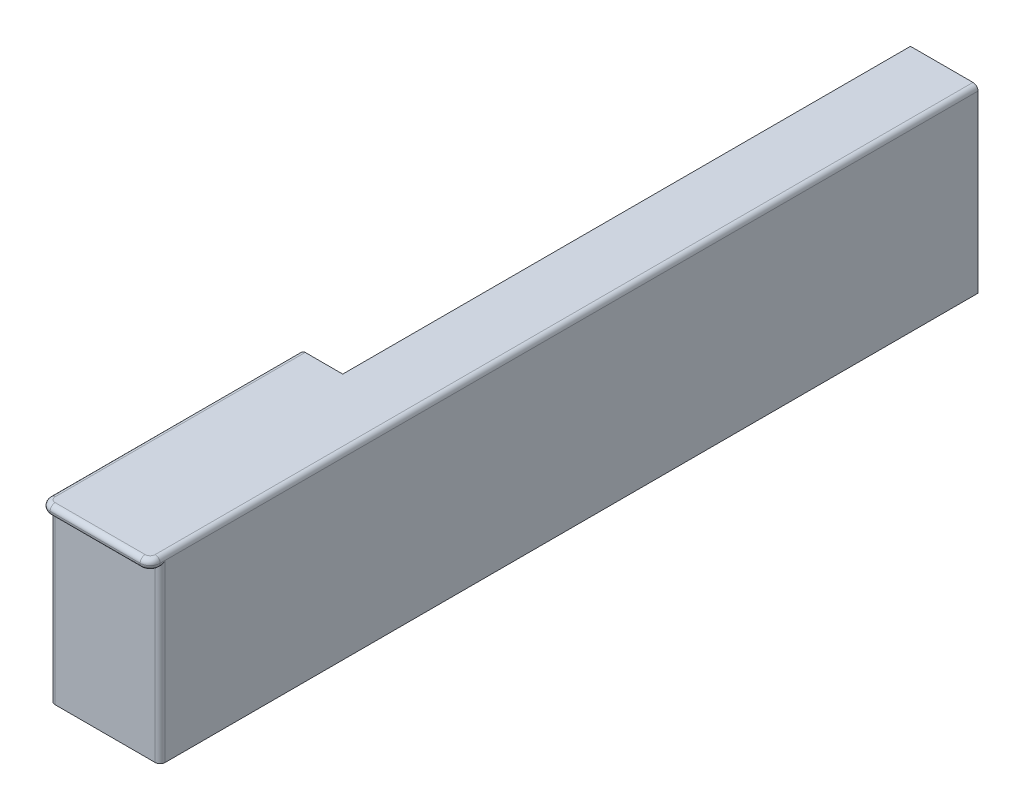
ISO-10303-21;
HEADER;
FILE_DESCRIPTION(('STEP AP214'),'2;1');
FILE_NAME('part.step','',(''),(''),'','','');
FILE_SCHEMA(('AUTOMOTIVE_DESIGN { 1 0 10303 214 1 1 1 1 }'));
ENDSEC;
DATA;
#1=APPLICATION_CONTEXT('core data for automotive mechanical design processes');
#2=APPLICATION_PROTOCOL_DEFINITION('international standard','automotive_design',2000,#1);
#3=PRODUCT_CONTEXT('',#1,'mechanical');
#4=PRODUCT('Part','Part','',(#3));
#5=PRODUCT_RELATED_PRODUCT_CATEGORY('part','',(#4));
#6=PRODUCT_DEFINITION_FORMATION('','',#4);
#7=PRODUCT_DEFINITION_CONTEXT('part definition',#1,'design');
#8=PRODUCT_DEFINITION('design','',#6,#7);
#9=PRODUCT_DEFINITION_SHAPE('','',#8);
#10=(LENGTH_UNIT() NAMED_UNIT(*) SI_UNIT(.MILLI.,.METRE.));
#11=(NAMED_UNIT(*) PLANE_ANGLE_UNIT() SI_UNIT($,.RADIAN.));
#12=(NAMED_UNIT(*) SI_UNIT($,.STERADIAN.) SOLID_ANGLE_UNIT());
#13=UNCERTAINTY_MEASURE_WITH_UNIT(LENGTH_MEASURE(1.E-05),#10,'distance_accuracy_value','');
#14=(GEOMETRIC_REPRESENTATION_CONTEXT(3) GLOBAL_UNCERTAINTY_ASSIGNED_CONTEXT((#13)) GLOBAL_UNIT_ASSIGNED_CONTEXT((#10,
#11,#12)) REPRESENTATION_CONTEXT('',''));
#15=CARTESIAN_POINT('',(0.,0.,0.));
#16=DIRECTION('',(0.,0.,1.));
#17=DIRECTION('',(1.,0.,0.));
#18=AXIS2_PLACEMENT_3D('',#15,#16,#17);
#19=CARTESIAN_POINT('',(-11.,36.,81.75));
#20=DIRECTION('',(0.,0.,-1.));
#21=DIRECTION('',(-1.,0.,0.));
#22=AXIS2_PLACEMENT_3D('',#19,#20,#21);
#23=PLANE('',#22);
#24=DIRECTION('',(1.,0.,0.));
#25=VECTOR('',#24,1.);
#26=CARTESIAN_POINT('',(-11.,34.,81.75));
#27=LINE('',#26,#25);
#28=CARTESIAN_POINT('',(-10.,34.,81.75));
#29=VERTEX_POINT('',#28);
#30=CARTESIAN_POINT('',(10.,34.,81.75));
#31=VERTEX_POINT('',#30);
#32=EDGE_CURVE('E211',#29,#31,#27,.T.);
#33=ORIENTED_EDGE('',*,*,#32,.F.);
#34=DIRECTION('',(0.,-1.,0.));
#35=VECTOR('',#34,1.);
#36=CARTESIAN_POINT('',(-10.,0.,81.75));
#37=LINE('',#36,#35);
#38=CARTESIAN_POINT('',(-10.,0.,81.75));
#39=VERTEX_POINT('',#38);
#40=EDGE_CURVE('E156',#29,#39,#37,.T.);
#41=ORIENTED_EDGE('',*,*,#40,.T.);
#42=DIRECTION('',(1.,0.,0.));
#43=VECTOR('',#42,1.);
#44=CARTESIAN_POINT('',(-11.,0.,81.75));
#45=LINE('',#44,#43);
#46=CARTESIAN_POINT('',(10.,0.,81.75));
#47=VERTEX_POINT('',#46);
#48=EDGE_CURVE('E213',#39,#47,#45,.T.);
#49=ORIENTED_EDGE('',*,*,#48,.T.);
#50=DIRECTION('',(0.,-1.,0.));
#51=VECTOR('',#50,1.);
#52=CARTESIAN_POINT('',(10.,36.,81.75));
#53=LINE('',#52,#51);
#54=EDGE_CURVE('E233',#47,#31,#53,.F.);
#55=ORIENTED_EDGE('',*,*,#54,.T.);
#56=EDGE_LOOP('',(#33,#41,#49,#55));
#57=FACE_BOUND('',#56,.T.);
#58=ADVANCED_FACE('F43',(#57),#23,.F.);
#59=CARTESIAN_POINT('',(-10.,36.,80.75));
#60=DIRECTION('',(0.,1.,0.));
#61=DIRECTION('',(0.,0.,1.));
#62=AXIS2_PLACEMENT_3D('',#59,#60,#61);
#63=CYLINDRICAL_SURFACE('',#62,1.);
#64=ORIENTED_EDGE('',*,*,#40,.F.);
#65=CARTESIAN_POINT('',(-10.,35.,80.75));
#66=DIRECTION('',(0.,-0.707106781186547,-0.707106781186547));
#67=DIRECTION('',(0.,0.707106781186547,-0.707106781186547));
#68=AXIS2_PLACEMENT_3D('',#65,#66,#67);
#69=ELLIPSE('',#68,1.41421356237309,1.);
#70=CARTESIAN_POINT('',(-11.,35.,80.75));
#71=VERTEX_POINT('',#70);
#72=EDGE_CURVE('E154',#29,#71,#69,.T.);
#73=ORIENTED_EDGE('',*,*,#72,.T.);
#74=DIRECTION('',(0.,-1.,0.));
#75=VECTOR('',#74,1.);
#76=CARTESIAN_POINT('',(-11.,36.,80.75));
#77=LINE('',#76,#75);
#78=CARTESIAN_POINT('',(-11.,0.,80.75));
#79=VERTEX_POINT('',#78);
#80=EDGE_CURVE('E141',#79,#71,#77,.F.);
#81=ORIENTED_EDGE('',*,*,#80,.F.);
#82=CARTESIAN_POINT('',(-10.,0.,80.75));
#83=DIRECTION('',(0.,1.,0.));
#84=DIRECTION('',(0.,0.,1.));
#85=AXIS2_PLACEMENT_3D('',#82,#83,#84);
#86=CIRCLE('',#85,1.);
#87=EDGE_CURVE('E151',#39,#79,#86,.F.);
#88=ORIENTED_EDGE('',*,*,#87,.F.);
#89=EDGE_LOOP('',(#64,#73,#81,#88));
#90=FACE_BOUND('',#89,.T.);
#91=ADVANCED_FACE('F155',(#90),#63,.T.);
#92=CARTESIAN_POINT('',(10.,36.,80.75));
#93=DIRECTION('',(0.,-1.,0.));
#94=DIRECTION('',(0.,0.,-1.));
#95=AXIS2_PLACEMENT_3D('',#92,#93,#94);
#96=CYLINDRICAL_SURFACE('',#95,1.);
#97=DIRECTION('',(0.,-1.,0.));
#98=VECTOR('',#97,1.);
#99=CARTESIAN_POINT('',(11.,36.,80.75));
#100=LINE('',#99,#98);
#101=CARTESIAN_POINT('',(11.,35.,80.75));
#102=VERTEX_POINT('',#101);
#103=CARTESIAN_POINT('',(11.,0.,80.75));
#104=VERTEX_POINT('',#103);
#105=EDGE_CURVE('E150',#102,#104,#100,.T.);
#106=ORIENTED_EDGE('',*,*,#105,.F.);
#107=CARTESIAN_POINT('',(10.,35.,80.75));
#108=DIRECTION('',(0.,-0.707106781186547,-0.707106781186547));
#109=DIRECTION('',(0.,0.707106781186547,-0.707106781186547));
#110=AXIS2_PLACEMENT_3D('',#107,#108,#109);
#111=ELLIPSE('',#110,1.41421356237309,1.);
#112=EDGE_CURVE('E51',#102,#31,#111,.T.);
#113=ORIENTED_EDGE('',*,*,#112,.T.);
#114=ORIENTED_EDGE('',*,*,#54,.F.);
#115=CARTESIAN_POINT('',(10.,0.,80.75));
#116=DIRECTION('',(0.,1.,0.));
#117=DIRECTION('',(0.,0.,1.));
#118=AXIS2_PLACEMENT_3D('',#115,#116,#117);
#119=CIRCLE('',#118,1.);
#120=EDGE_CURVE('E236',#104,#47,#119,.F.);
#121=ORIENTED_EDGE('',*,*,#120,.F.);
#122=EDGE_LOOP('',(#106,#113,#114,#121));
#123=FACE_BOUND('',#122,.T.);
#124=ADVANCED_FACE('F326',(#123),#96,.T.);
#125=CARTESIAN_POINT('',(11.,36.,81.75));
#126=DIRECTION('',(-1.,0.,0.));
#127=DIRECTION('',(0.,0.,1.));
#128=AXIS2_PLACEMENT_3D('',#125,#126,#127);
#129=PLANE('',#128);
#130=DIRECTION('',(0.,-1.,0.));
#131=VECTOR('',#130,1.);
#132=CARTESIAN_POINT('',(11.,36.,-81.75));
#133=LINE('',#132,#131);
#134=CARTESIAN_POINT('',(11.,35.,-81.75));
#135=VERTEX_POINT('',#134);
#136=CARTESIAN_POINT('',(11.,0.,-81.75));
#137=VERTEX_POINT('',#136);
#138=EDGE_CURVE('E224',#135,#137,#133,.T.);
#139=ORIENTED_EDGE('',*,*,#138,.F.);
#140=DIRECTION('',(0.,0.,-1.));
#141=VECTOR('',#140,1.);
#142=CARTESIAN_POINT('',(11.,35.,81.75));
#143=LINE('',#142,#141);
#144=EDGE_CURVE('E167',#135,#102,#143,.F.);
#145=ORIENTED_EDGE('',*,*,#144,.T.);
#146=ORIENTED_EDGE('',*,*,#105,.T.);
#147=DIRECTION('',(0.,0.,-1.));
#148=VECTOR('',#147,1.);
#149=CARTESIAN_POINT('',(11.,0.,81.75));
#150=LINE('',#149,#148);
#151=EDGE_CURVE('E218',#104,#137,#150,.T.);
#152=ORIENTED_EDGE('',*,*,#151,.T.);
#153=EDGE_LOOP('',(#139,#145,#146,#152));
#154=FACE_BOUND('',#153,.T.);
#155=ADVANCED_FACE('F261',(#154),#129,.F.);
#156=CARTESIAN_POINT('',(-11.,36.,-81.75));
#157=DIRECTION('',(0.,0.,-1.));
#158=DIRECTION('',(-1.,0.,0.));
#159=AXIS2_PLACEMENT_3D('',#156,#157,#158);
#160=PLANE('',#159);
#161=DIRECTION('',(0.,1.,0.));
#162=VECTOR('',#161,1.);
#163=CARTESIAN_POINT('',(-2.5,0.,-81.75));
#164=LINE('',#163,#162);
#165=CARTESIAN_POINT('',(-2.5,0.,-81.75));
#166=VERTEX_POINT('',#165);
#167=CARTESIAN_POINT('',(-2.5,36.,-81.75));
#168=VERTEX_POINT('',#167);
#169=EDGE_CURVE('E183',#166,#168,#164,.T.);
#170=ORIENTED_EDGE('',*,*,#169,.T.);
#171=DIRECTION('',(1.,0.,0.));
#172=VECTOR('',#171,1.);
#173=CARTESIAN_POINT('',(-11.,36.,-81.75));
#174=LINE('',#173,#172);
#175=CARTESIAN_POINT('',(10.,36.,-81.75));
#176=VERTEX_POINT('',#175);
#177=EDGE_CURVE('E223',#168,#176,#174,.T.);
#178=ORIENTED_EDGE('',*,*,#177,.T.);
#179=CARTESIAN_POINT('',(10.,35.,-81.75));
#180=DIRECTION('',(0.,0.,-1.));
#181=DIRECTION('',(-1.,0.,0.));
#182=AXIS2_PLACEMENT_3D('',#179,#180,#181);
#183=CIRCLE('',#182,1.);
#184=EDGE_CURVE('E172',#176,#135,#183,.T.);
#185=ORIENTED_EDGE('',*,*,#184,.T.);
#186=ORIENTED_EDGE('',*,*,#138,.T.);
#187=DIRECTION('',(1.,0.,0.));
#188=VECTOR('',#187,1.);
#189=CARTESIAN_POINT('',(-11.,0.,-81.75));
#190=LINE('',#189,#188);
#191=EDGE_CURVE('E228',#166,#137,#190,.T.);
#192=ORIENTED_EDGE('',*,*,#191,.F.);
#193=EDGE_LOOP('',(#170,#178,#185,#186,#192));
#194=FACE_BOUND('',#193,.T.);
#195=ADVANCED_FACE('F254',(#194),#160,.T.);
#196=CARTESIAN_POINT('',(-11.,36.,81.75));
#197=DIRECTION('',(-1.,0.,0.));
#198=DIRECTION('',(0.,0.,1.));
#199=AXIS2_PLACEMENT_3D('',#196,#197,#198);
#200=PLANE('',#199);
#201=DIRECTION('',(0.,1.,0.));
#202=VECTOR('',#201,1.);
#203=CARTESIAN_POINT('',(-11.,0.,31.75));
#204=LINE('',#203,#202);
#205=CARTESIAN_POINT('',(-11.,0.,31.75));
#206=VERTEX_POINT('',#205);
#207=CARTESIAN_POINT('',(-11.,35.,31.75));
#208=VERTEX_POINT('',#207);
#209=EDGE_CURVE('E57',#206,#208,#204,.T.);
#210=ORIENTED_EDGE('',*,*,#209,.F.);
#211=DIRECTION('',(0.,0.,-1.));
#212=VECTOR('',#211,1.);
#213=CARTESIAN_POINT('',(-11.,0.,81.75));
#214=LINE('',#213,#212);
#215=EDGE_CURVE('E147',#79,#206,#214,.T.);
#216=ORIENTED_EDGE('',*,*,#215,.F.);
#217=ORIENTED_EDGE('',*,*,#80,.T.);
#218=DIRECTION('',(0.,0.,-1.));
#219=VECTOR('',#218,1.);
#220=CARTESIAN_POINT('',(-11.,35.,81.75));
#221=LINE('',#220,#219);
#222=EDGE_CURVE('E145',#71,#208,#221,.T.);
#223=ORIENTED_EDGE('',*,*,#222,.T.);
#224=EDGE_LOOP('',(#210,#216,#217,#223));
#225=FACE_BOUND('',#224,.T.);
#226=ADVANCED_FACE('F143',(#225),#200,.T.);
#227=CARTESIAN_POINT('',(0.,36.,0.));
#228=DIRECTION('',(0.,1.,0.));
#229=DIRECTION('',(0.,0.,1.));
#230=AXIS2_PLACEMENT_3D('',#227,#228,#229);
#231=PLANE('',#230);
#232=DIRECTION('',(0.,0.,-1.));
#233=VECTOR('',#232,1.);
#234=CARTESIAN_POINT('',(-2.5,36.,-81.75));
#235=LINE('',#234,#233);
#236=CARTESIAN_POINT('',(-2.49999999999999,36.,31.75));
#237=VERTEX_POINT('',#236);
#238=EDGE_CURVE('E296',#237,#168,#235,.T.);
#239=ORIENTED_EDGE('',*,*,#238,.F.);
#240=DIRECTION('',(1.,0.,0.));
#241=VECTOR('',#240,1.);
#242=CARTESIAN_POINT('',(-11.,36.,31.75));
#243=LINE('',#242,#241);
#244=CARTESIAN_POINT('',(-10.,36.,31.75));
#245=VERTEX_POINT('',#244);
#246=EDGE_CURVE('E293',#245,#237,#243,.T.);
#247=ORIENTED_EDGE('',*,*,#246,.F.);
#248=DIRECTION('',(0.,0.,-1.));
#249=VECTOR('',#248,1.);
#250=CARTESIAN_POINT('',(-10.,36.,0.));
#251=LINE('',#250,#249);
#252=CARTESIAN_POINT('',(-10.,36.,81.75));
#253=VERTEX_POINT('',#252);
#254=EDGE_CURVE('E240',#245,#253,#251,.F.);
#255=ORIENTED_EDGE('',*,*,#254,.T.);
#256=CARTESIAN_POINT('',(-9.,36.,81.75));
#257=DIRECTION('',(0.,1.,0.));
#258=DIRECTION('',(0.,0.,1.));
#259=AXIS2_PLACEMENT_3D('',#256,#257,#258);
#260=CIRCLE('',#259,1.);
#261=CARTESIAN_POINT('',(-9.,36.,82.75));
#262=VERTEX_POINT('',#261);
#263=EDGE_CURVE('E242',#253,#262,#260,.T.);
#264=ORIENTED_EDGE('',*,*,#263,.T.);
#265=DIRECTION('',(1.,0.,0.));
#266=VECTOR('',#265,1.);
#267=CARTESIAN_POINT('',(0.,36.,82.75));
#268=LINE('',#267,#266);
#269=CARTESIAN_POINT('',(9.,36.,82.75));
#270=VERTEX_POINT('',#269);
#271=EDGE_CURVE('E244',#262,#270,#268,.T.);
#272=ORIENTED_EDGE('',*,*,#271,.T.);
#273=CARTESIAN_POINT('',(9.,36.,81.75));
#274=DIRECTION('',(0.,1.,0.));
#275=DIRECTION('',(0.,0.,1.));
#276=AXIS2_PLACEMENT_3D('',#273,#274,#275);
#277=CIRCLE('',#276,1.);
#278=CARTESIAN_POINT('',(10.,36.,81.75));
#279=VERTEX_POINT('',#278);
#280=EDGE_CURVE('E246',#270,#279,#277,.T.);
#281=ORIENTED_EDGE('',*,*,#280,.T.);
#282=DIRECTION('',(0.,0.,-1.));
#283=VECTOR('',#282,1.);
#284=CARTESIAN_POINT('',(10.,36.,-81.75));
#285=LINE('',#284,#283);
#286=EDGE_CURVE('E248',#279,#176,#285,.T.);
#287=ORIENTED_EDGE('',*,*,#286,.T.);
#288=ORIENTED_EDGE('',*,*,#177,.F.);
#289=EDGE_LOOP('',(#239,#247,#255,#264,#272,#281,#287,#288));
#290=FACE_BOUND('',#289,.T.);
#291=ADVANCED_FACE('F291',(#290),#231,.T.);
#292=CARTESIAN_POINT('',(0.,0.,0.));
#293=DIRECTION('',(0.,1.,0.));
#294=DIRECTION('',(0.,0.,1.));
#295=AXIS2_PLACEMENT_3D('',#292,#293,#294);
#296=PLANE('',#295);
#297=DIRECTION('',(1.,0.,0.));
#298=VECTOR('',#297,1.);
#299=CARTESIAN_POINT('',(-11.,0.,31.75));
#300=LINE('',#299,#298);
#301=CARTESIAN_POINT('',(-2.49999999999999,0.,31.75));
#302=VERTEX_POINT('',#301);
#303=EDGE_CURVE('E300',#206,#302,#300,.T.);
#304=ORIENTED_EDGE('',*,*,#303,.T.);
#305=DIRECTION('',(0.,0.,-1.));
#306=VECTOR('',#305,1.);
#307=CARTESIAN_POINT('',(-2.5,0.,-81.75));
#308=LINE('',#307,#306);
#309=EDGE_CURVE('E303',#302,#166,#308,.T.);
#310=ORIENTED_EDGE('',*,*,#309,.T.);
#311=ORIENTED_EDGE('',*,*,#191,.T.);
#312=ORIENTED_EDGE('',*,*,#151,.F.);
#313=ORIENTED_EDGE('',*,*,#120,.T.);
#314=ORIENTED_EDGE('',*,*,#48,.F.);
#315=ORIENTED_EDGE('',*,*,#87,.T.);
#316=ORIENTED_EDGE('',*,*,#215,.T.);
#317=EDGE_LOOP('',(#304,#310,#311,#312,#313,#314,#315,#316));
#318=FACE_BOUND('',#317,.T.);
#319=ADVANCED_FACE('F313',(#318),#296,.F.);
#320=CARTESIAN_POINT('',(0.,34.,0.));
#321=DIRECTION('',(0.,1.,0.));
#322=DIRECTION('',(0.,0.,1.));
#323=AXIS2_PLACEMENT_3D('',#320,#321,#322);
#324=PLANE('',#323);
#325=DIRECTION('',(1.,0.,0.));
#326=VECTOR('',#325,1.);
#327=CARTESIAN_POINT('',(-9.,34.,82.75));
#328=LINE('',#327,#326);
#329=CARTESIAN_POINT('',(9.,34.,82.75));
#330=VERTEX_POINT('',#329);
#331=CARTESIAN_POINT('',(-9.,34.,82.75));
#332=VERTEX_POINT('',#331);
#333=EDGE_CURVE('E66',#330,#332,#328,.F.);
#334=ORIENTED_EDGE('',*,*,#333,.T.);
#335=CARTESIAN_POINT('',(-9.,34.,81.75));
#336=DIRECTION('',(0.,1.,0.));
#337=DIRECTION('',(0.,0.,1.));
#338=AXIS2_PLACEMENT_3D('',#335,#336,#337);
#339=CIRCLE('',#338,1.);
#340=EDGE_CURVE('E157',#332,#29,#339,.F.);
#341=ORIENTED_EDGE('',*,*,#340,.T.);
#342=ORIENTED_EDGE('',*,*,#32,.T.);
#343=CARTESIAN_POINT('',(9.,34.,81.75));
#344=DIRECTION('',(0.,1.,0.));
#345=DIRECTION('',(0.,0.,1.));
#346=AXIS2_PLACEMENT_3D('',#343,#344,#345);
#347=CIRCLE('',#346,1.);
#348=EDGE_CURVE('E169',#31,#330,#347,.F.);
#349=ORIENTED_EDGE('',*,*,#348,.T.);
#350=EDGE_LOOP('',(#334,#341,#342,#349));
#351=FACE_BOUND('',#350,.T.);
#352=ADVANCED_FACE('F347',(#351),#324,.F.);
#353=CARTESIAN_POINT('',(-10.,35.,81.75));
#354=DIRECTION('',(0.,0.,-1.));
#355=DIRECTION('',(-1.,0.,0.));
#356=AXIS2_PLACEMENT_3D('',#353,#354,#355);
#357=CYLINDRICAL_SURFACE('',#356,1.);
#358=DIRECTION('',(0.,0.,1.));
#359=VECTOR('',#358,1.);
#360=CARTESIAN_POINT('',(-11.,35.,81.75));
#361=LINE('',#360,#359);
#362=CARTESIAN_POINT('',(-11.,35.,81.75));
#363=VERTEX_POINT('',#362);
#364=EDGE_CURVE('E159',#71,#363,#361,.T.);
#365=ORIENTED_EDGE('',*,*,#364,.F.);
#366=ORIENTED_EDGE('',*,*,#72,.F.);
#367=CARTESIAN_POINT('',(-10.,35.,81.75));
#368=DIRECTION('',(0.,0.,1.));
#369=DIRECTION('',(1.,0.,0.));
#370=AXIS2_PLACEMENT_3D('',#367,#368,#369);
#371=CIRCLE('',#370,1.);
#372=EDGE_CURVE('E88',#363,#29,#371,.T.);
#373=ORIENTED_EDGE('',*,*,#372,.F.);
#374=EDGE_LOOP('',(#365,#366,#373));
#375=FACE_BOUND('',#374,.T.);
#376=ADVANCED_FACE('F45',(#375),#357,.T.);
#377=CARTESIAN_POINT('',(-9.,35.,81.75));
#378=DIRECTION('',(0.,1.,0.));
#379=DIRECTION('',(0.,0.,1.));
#380=AXIS2_PLACEMENT_3D('',#377,#378,#379);
#381=DEGENERATE_TOROIDAL_SURFACE('',#380,1.,1.,.T.);
#382=ORIENTED_EDGE('',*,*,#372,.T.);
#383=ORIENTED_EDGE('',*,*,#340,.F.);
#384=CARTESIAN_POINT('',(-9.,35.,82.75));
#385=DIRECTION('',(1.,0.,0.));
#386=DIRECTION('',(0.,0.,-1.));
#387=AXIS2_PLACEMENT_3D('',#384,#385,#386);
#388=CIRCLE('',#387,1.);
#389=CARTESIAN_POINT('',(-9.,35.,83.75));
#390=VERTEX_POINT('',#389);
#391=EDGE_CURVE('E163',#390,#332,#388,.T.);
#392=ORIENTED_EDGE('',*,*,#391,.F.);
#393=CARTESIAN_POINT('',(-9.,35.,81.75));
#394=DIRECTION('',(0.,1.,0.));
#395=DIRECTION('',(0.,0.,1.));
#396=AXIS2_PLACEMENT_3D('',#393,#394,#395);
#397=CIRCLE('',#396,2.);
#398=EDGE_CURVE('E207',#363,#390,#397,.T.);
#399=ORIENTED_EDGE('',*,*,#398,.F.);
#400=EDGE_LOOP('',(#382,#383,#392,#399));
#401=FACE_BOUND('',#400,.T.);
#402=ADVANCED_FACE('F283',(#401),#381,.T.);
#403=CARTESIAN_POINT('',(-10.,35.,81.75));
#404=DIRECTION('',(0.,0.,-1.));
#405=DIRECTION('',(-1.,0.,0.));
#406=AXIS2_PLACEMENT_3D('',#403,#404,#405);
#407=CYLINDRICAL_SURFACE('',#406,1.);
#408=CARTESIAN_POINT('',(-10.,35.,31.75));
#409=DIRECTION('',(0.,0.,1.));
#410=DIRECTION('',(1.,0.,0.));
#411=AXIS2_PLACEMENT_3D('',#408,#409,#410);
#412=CIRCLE('',#411,1.);
#413=EDGE_CURVE('E11',#208,#245,#412,.F.);
#414=ORIENTED_EDGE('',*,*,#413,.F.);
#415=ORIENTED_EDGE('',*,*,#222,.F.);
#416=ORIENTED_EDGE('',*,*,#364,.T.);
#417=CARTESIAN_POINT('',(-10.,35.,81.75));
#418=DIRECTION('',(0.,0.,1.));
#419=DIRECTION('',(1.,0.,0.));
#420=AXIS2_PLACEMENT_3D('',#417,#418,#419);
#421=CIRCLE('',#420,1.);
#422=EDGE_CURVE('E204',#253,#363,#421,.T.);
#423=ORIENTED_EDGE('',*,*,#422,.F.);
#424=ORIENTED_EDGE('',*,*,#254,.F.);
#425=EDGE_LOOP('',(#414,#415,#416,#423,#424));
#426=FACE_BOUND('',#425,.T.);
#427=ADVANCED_FACE('F165',(#426),#407,.T.);
#428=CARTESIAN_POINT('',(-11.,35.,82.75));
#429=DIRECTION('',(-1.,0.,0.));
#430=DIRECTION('',(0.,0.,1.));
#431=AXIS2_PLACEMENT_3D('',#428,#429,#430);
#432=CYLINDRICAL_SURFACE('',#431,1.);
#433=ORIENTED_EDGE('',*,*,#391,.T.);
#434=ORIENTED_EDGE('',*,*,#333,.F.);
#435=CARTESIAN_POINT('',(9.,35.,82.75));
#436=DIRECTION('',(1.,0.,0.));
#437=DIRECTION('',(0.,0.,-1.));
#438=AXIS2_PLACEMENT_3D('',#435,#436,#437);
#439=CIRCLE('',#438,1.);
#440=CARTESIAN_POINT('',(9.,35.,83.75));
#441=VERTEX_POINT('',#440);
#442=EDGE_CURVE('E201',#441,#330,#439,.T.);
#443=ORIENTED_EDGE('',*,*,#442,.F.);
#444=DIRECTION('',(1.,0.,0.));
#445=VECTOR('',#444,1.);
#446=CARTESIAN_POINT('',(9.,35.,83.75));
#447=LINE('',#446,#445);
#448=EDGE_CURVE('E198',#390,#441,#447,.T.);
#449=ORIENTED_EDGE('',*,*,#448,.F.);
#450=EDGE_LOOP('',(#433,#434,#443,#449));
#451=FACE_BOUND('',#450,.T.);
#452=ADVANCED_FACE('F282',(#451),#432,.T.);
#453=CARTESIAN_POINT('',(-9.,35.,81.75));
#454=DIRECTION('',(0.,1.,0.));
#455=DIRECTION('',(0.,0.,1.));
#456=AXIS2_PLACEMENT_3D('',#453,#454,#455);
#457=DEGENERATE_TOROIDAL_SURFACE('',#456,1.,1.,.T.);
#458=ORIENTED_EDGE('',*,*,#422,.T.);
#459=ORIENTED_EDGE('',*,*,#398,.T.);
#460=CARTESIAN_POINT('',(-9.,35.,82.75));
#461=DIRECTION('',(1.,0.,0.));
#462=DIRECTION('',(0.,0.,-1.));
#463=AXIS2_PLACEMENT_3D('',#460,#461,#462);
#464=CIRCLE('',#463,1.);
#465=EDGE_CURVE('E195',#262,#390,#464,.T.);
#466=ORIENTED_EDGE('',*,*,#465,.F.);
#467=ORIENTED_EDGE('',*,*,#263,.F.);
#468=EDGE_LOOP('',(#458,#459,#466,#467));
#469=FACE_BOUND('',#468,.T.);
#470=ADVANCED_FACE('F285',(#469),#457,.T.);
#471=CARTESIAN_POINT('',(9.,35.,81.75));
#472=DIRECTION('',(0.,1.,0.));
#473=DIRECTION('',(0.,0.,1.));
#474=AXIS2_PLACEMENT_3D('',#471,#472,#473);
#475=DEGENERATE_TOROIDAL_SURFACE('',#474,1.,1.,.T.);
#476=ORIENTED_EDGE('',*,*,#442,.T.);
#477=ORIENTED_EDGE('',*,*,#348,.F.);
#478=CARTESIAN_POINT('',(10.,35.,81.75));
#479=DIRECTION('',(0.,0.,-1.));
#480=DIRECTION('',(-1.,0.,0.));
#481=AXIS2_PLACEMENT_3D('',#478,#479,#480);
#482=CIRCLE('',#481,1.);
#483=CARTESIAN_POINT('',(11.,35.,81.75));
#484=VERTEX_POINT('',#483);
#485=EDGE_CURVE('E192',#484,#31,#482,.T.);
#486=ORIENTED_EDGE('',*,*,#485,.F.);
#487=CARTESIAN_POINT('',(9.,35.,81.75));
#488=DIRECTION('',(0.,1.,0.));
#489=DIRECTION('',(0.,0.,1.));
#490=AXIS2_PLACEMENT_3D('',#487,#488,#489);
#491=CIRCLE('',#490,2.);
#492=EDGE_CURVE('E189',#441,#484,#491,.T.);
#493=ORIENTED_EDGE('',*,*,#492,.F.);
#494=EDGE_LOOP('',(#476,#477,#486,#493));
#495=FACE_BOUND('',#494,.T.);
#496=ADVANCED_FACE('F271',(#495),#475,.T.);
#497=CARTESIAN_POINT('',(0.,35.,82.75));
#498=DIRECTION('',(1.,0.,0.));
#499=DIRECTION('',(0.,0.,-1.));
#500=AXIS2_PLACEMENT_3D('',#497,#498,#499);
#501=CYLINDRICAL_SURFACE('',#500,1.);
#502=ORIENTED_EDGE('',*,*,#465,.T.);
#503=ORIENTED_EDGE('',*,*,#448,.T.);
#504=CARTESIAN_POINT('',(9.,35.,82.75));
#505=DIRECTION('',(1.,0.,0.));
#506=DIRECTION('',(0.,0.,-1.));
#507=AXIS2_PLACEMENT_3D('',#504,#505,#506);
#508=CIRCLE('',#507,1.);
#509=EDGE_CURVE('E186',#270,#441,#508,.T.);
#510=ORIENTED_EDGE('',*,*,#509,.F.);
#511=ORIENTED_EDGE('',*,*,#271,.F.);
#512=EDGE_LOOP('',(#502,#503,#510,#511));
#513=FACE_BOUND('',#512,.T.);
#514=ADVANCED_FACE('F278',(#513),#501,.T.);
#515=CARTESIAN_POINT('',(10.,35.,81.75));
#516=DIRECTION('',(0.,0.,-1.));
#517=DIRECTION('',(-1.,0.,0.));
#518=AXIS2_PLACEMENT_3D('',#515,#516,#517);
#519=CYLINDRICAL_SURFACE('',#518,1.);
#520=ORIENTED_EDGE('',*,*,#485,.T.);
#521=ORIENTED_EDGE('',*,*,#112,.F.);
#522=DIRECTION('',(0.,0.,-1.));
#523=VECTOR('',#522,1.);
#524=CARTESIAN_POINT('',(11.,35.,81.75));
#525=LINE('',#524,#523);
#526=EDGE_CURVE('E182',#484,#102,#525,.T.);
#527=ORIENTED_EDGE('',*,*,#526,.F.);
#528=EDGE_LOOP('',(#520,#521,#527));
#529=FACE_BOUND('',#528,.T.);
#530=ADVANCED_FACE('F267',(#529),#519,.T.);
#531=CARTESIAN_POINT('',(9.,35.,81.75));
#532=DIRECTION('',(0.,1.,0.));
#533=DIRECTION('',(0.,0.,1.));
#534=AXIS2_PLACEMENT_3D('',#531,#532,#533);
#535=DEGENERATE_TOROIDAL_SURFACE('',#534,1.,1.,.T.);
#536=ORIENTED_EDGE('',*,*,#509,.T.);
#537=ORIENTED_EDGE('',*,*,#492,.T.);
#538=CARTESIAN_POINT('',(10.,35.,81.75));
#539=DIRECTION('',(0.,0.,-1.));
#540=DIRECTION('',(-1.,0.,0.));
#541=AXIS2_PLACEMENT_3D('',#538,#539,#540);
#542=CIRCLE('',#541,1.);
#543=EDGE_CURVE('E179',#279,#484,#542,.T.);
#544=ORIENTED_EDGE('',*,*,#543,.F.);
#545=ORIENTED_EDGE('',*,*,#280,.F.);
#546=EDGE_LOOP('',(#536,#537,#544,#545));
#547=FACE_BOUND('',#546,.T.);
#548=ADVANCED_FACE('F273',(#547),#535,.T.);
#549=CARTESIAN_POINT('',(10.,35.,0.));
#550=DIRECTION('',(0.,0.,1.));
#551=DIRECTION('',(1.,0.,0.));
#552=AXIS2_PLACEMENT_3D('',#549,#550,#551);
#553=CYLINDRICAL_SURFACE('',#552,1.);
#554=ORIENTED_EDGE('',*,*,#526,.T.);
#555=ORIENTED_EDGE('',*,*,#144,.F.);
#556=ORIENTED_EDGE('',*,*,#184,.F.);
#557=ORIENTED_EDGE('',*,*,#286,.F.);
#558=ORIENTED_EDGE('',*,*,#543,.T.);
#559=EDGE_LOOP('',(#554,#555,#556,#557,#558));
#560=FACE_BOUND('',#559,.T.);
#561=ADVANCED_FACE('F263',(#560),#553,.T.);
#562=CARTESIAN_POINT('',(-2.5,0.,-81.75));
#563=DIRECTION('',(1.,0.,0.));
#564=DIRECTION('',(0.,0.,-1.));
#565=AXIS2_PLACEMENT_3D('',#562,#563,#564);
#566=PLANE('',#565);
#567=ORIENTED_EDGE('',*,*,#238,.T.);
#568=ORIENTED_EDGE('',*,*,#169,.F.);
#569=ORIENTED_EDGE('',*,*,#309,.F.);
#570=DIRECTION('',(0.,1.,0.));
#571=VECTOR('',#570,1.);
#572=CARTESIAN_POINT('',(-2.49999999999999,0.,31.75));
#573=LINE('',#572,#571);
#574=EDGE_CURVE('E306',#302,#237,#573,.T.);
#575=ORIENTED_EDGE('',*,*,#574,.T.);
#576=EDGE_LOOP('',(#567,#568,#569,#575));
#577=FACE_BOUND('',#576,.T.);
#578=ADVANCED_FACE('F322',(#577),#566,.F.);
#579=CARTESIAN_POINT('',(-11.,0.,31.75));
#580=DIRECTION('',(0.,0.,1.));
#581=DIRECTION('',(1.,0.,0.));
#582=AXIS2_PLACEMENT_3D('',#579,#580,#581);
#583=PLANE('',#582);
#584=ORIENTED_EDGE('',*,*,#413,.T.);
#585=ORIENTED_EDGE('',*,*,#246,.T.);
#586=ORIENTED_EDGE('',*,*,#574,.F.);
#587=ORIENTED_EDGE('',*,*,#303,.F.);
#588=ORIENTED_EDGE('',*,*,#209,.T.);
#589=EDGE_LOOP('',(#584,#585,#586,#587,#588));
#590=FACE_BOUND('',#589,.T.);
#591=ADVANCED_FACE('F316',(#590),#583,.F.);
#592=CLOSED_SHELL('',(#58,#91,#124,#155,#195,#226,#291,#319,#352,#376,#402,#427,#452,#470,#496,
#514,#530,#548,#561,#578,#591));
#593=MANIFOLD_SOLID_BREP('B2',#592);
#594=ADVANCED_BREP_SHAPE_REPRESENTATION('',(#18,#593),#14);
#595=SHAPE_DEFINITION_REPRESENTATION(#9,#594);
ENDSEC;
END-ISO-10303-21;
